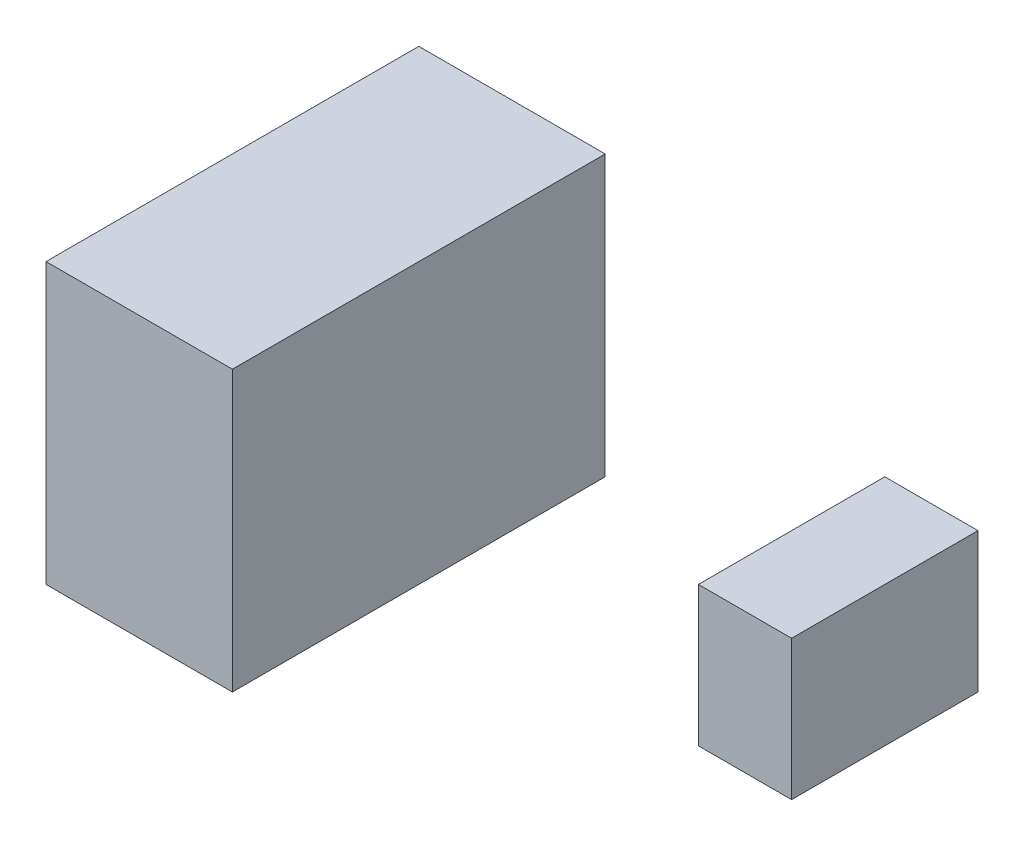
ISO-10303-21;
HEADER;
FILE_DESCRIPTION(('STEP AP214'),'2;1');
FILE_NAME('part.step','',(''),(''),'','','');
FILE_SCHEMA(('AUTOMOTIVE_DESIGN { 1 0 10303 214 1 1 1 1 }'));
ENDSEC;
DATA;
#1=APPLICATION_CONTEXT('core data for automotive mechanical design processes');
#2=APPLICATION_PROTOCOL_DEFINITION('international standard','automotive_design',2000,#1);
#3=PRODUCT_CONTEXT('',#1,'mechanical');
#4=PRODUCT('Part','Part','',(#3));
#5=PRODUCT_RELATED_PRODUCT_CATEGORY('part','',(#4));
#6=PRODUCT_DEFINITION_FORMATION('','',#4);
#7=PRODUCT_DEFINITION_CONTEXT('part definition',#1,'design');
#8=PRODUCT_DEFINITION('design','',#6,#7);
#9=PRODUCT_DEFINITION_SHAPE('','',#8);
#10=(LENGTH_UNIT() NAMED_UNIT(*) SI_UNIT(.MILLI.,.METRE.));
#11=(NAMED_UNIT(*) PLANE_ANGLE_UNIT() SI_UNIT($,.RADIAN.));
#12=(NAMED_UNIT(*) SI_UNIT($,.STERADIAN.) SOLID_ANGLE_UNIT());
#13=UNCERTAINTY_MEASURE_WITH_UNIT(LENGTH_MEASURE(1.E-05),#10,'distance_accuracy_value','');
#14=(GEOMETRIC_REPRESENTATION_CONTEXT(3) GLOBAL_UNCERTAINTY_ASSIGNED_CONTEXT((#13)) GLOBAL_UNIT_ASSIGNED_CONTEXT((#10,
#11,#12)) REPRESENTATION_CONTEXT('',''));
#15=CARTESIAN_POINT('',(0.,0.,0.));
#16=DIRECTION('',(0.,0.,1.));
#17=DIRECTION('',(1.,0.,0.));
#18=AXIS2_PLACEMENT_3D('',#15,#16,#17);
#19=CARTESIAN_POINT('',(50.,15.,20.));
#20=DIRECTION('',(1.,0.,0.));
#21=DIRECTION('',(0.,0.,-1.));
#22=AXIS2_PLACEMENT_3D('',#19,#20,#21);
#23=PLANE('',#22);
#24=DIRECTION('',(0.,-1.,0.));
#25=VECTOR('',#24,1.);
#26=CARTESIAN_POINT('',(50.,15.,0.));
#27=LINE('',#26,#25);
#28=CARTESIAN_POINT('',(50.,15.,0.));
#29=VERTEX_POINT('',#28);
#30=CARTESIAN_POINT('',(50.,0.,0.));
#31=VERTEX_POINT('',#30);
#32=EDGE_CURVE('E116',#29,#31,#27,.T.);
#33=ORIENTED_EDGE('',*,*,#32,.T.);
#34=DIRECTION('',(0.,0.,-1.));
#35=VECTOR('',#34,1.);
#36=CARTESIAN_POINT('',(50.,0.,20.));
#37=LINE('',#36,#35);
#38=CARTESIAN_POINT('',(50.,0.,20.));
#39=VERTEX_POINT('',#38);
#40=EDGE_CURVE('E12',#39,#31,#37,.T.);
#41=ORIENTED_EDGE('',*,*,#40,.F.);
#42=DIRECTION('',(0.,-1.,0.));
#43=VECTOR('',#42,1.);
#44=CARTESIAN_POINT('',(50.,15.,20.));
#45=LINE('',#44,#43);
#46=CARTESIAN_POINT('',(50.,15.,20.));
#47=VERTEX_POINT('',#46);
#48=EDGE_CURVE('E104',#47,#39,#45,.T.);
#49=ORIENTED_EDGE('',*,*,#48,.F.);
#50=DIRECTION('',(0.,0.,-1.));
#51=VECTOR('',#50,1.);
#52=CARTESIAN_POINT('',(50.,15.,20.));
#53=LINE('',#52,#51);
#54=EDGE_CURVE('E112',#47,#29,#53,.T.);
#55=ORIENTED_EDGE('',*,*,#54,.T.);
#56=EDGE_LOOP('',(#33,#41,#49,#55));
#57=FACE_BOUND('',#56,.T.);
#58=ADVANCED_FACE('F53',(#57),#23,.F.);
#59=CARTESIAN_POINT('',(50.,0.,20.));
#60=DIRECTION('',(0.,1.,0.));
#61=DIRECTION('',(0.,0.,1.));
#62=AXIS2_PLACEMENT_3D('',#59,#60,#61);
#63=PLANE('',#62);
#64=DIRECTION('',(1.,0.,0.));
#65=VECTOR('',#64,1.);
#66=CARTESIAN_POINT('',(50.,0.,0.));
#67=LINE('',#66,#65);
#68=CARTESIAN_POINT('',(60.,0.,0.));
#69=VERTEX_POINT('',#68);
#70=EDGE_CURVE('E108',#31,#69,#67,.T.);
#71=ORIENTED_EDGE('',*,*,#70,.T.);
#72=DIRECTION('',(0.,0.,-1.));
#73=VECTOR('',#72,1.);
#74=CARTESIAN_POINT('',(60.,0.,20.));
#75=LINE('',#74,#73);
#76=CARTESIAN_POINT('',(60.,0.,20.));
#77=VERTEX_POINT('',#76);
#78=EDGE_CURVE('E61',#77,#69,#75,.T.);
#79=ORIENTED_EDGE('',*,*,#78,.F.);
#80=DIRECTION('',(1.,0.,0.));
#81=VECTOR('',#80,1.);
#82=CARTESIAN_POINT('',(50.,0.,20.));
#83=LINE('',#82,#81);
#84=EDGE_CURVE('E99',#39,#77,#83,.T.);
#85=ORIENTED_EDGE('',*,*,#84,.F.);
#86=ORIENTED_EDGE('',*,*,#40,.T.);
#87=EDGE_LOOP('',(#71,#79,#85,#86));
#88=FACE_BOUND('',#87,.T.);
#89=ADVANCED_FACE('F107',(#88),#63,.F.);
#90=CARTESIAN_POINT('',(60.,0.,20.));
#91=DIRECTION('',(-1.,0.,0.));
#92=DIRECTION('',(0.,0.,1.));
#93=AXIS2_PLACEMENT_3D('',#90,#91,#92);
#94=PLANE('',#93);
#95=DIRECTION('',(0.,1.,0.));
#96=VECTOR('',#95,1.);
#97=CARTESIAN_POINT('',(60.,0.,0.));
#98=LINE('',#97,#96);
#99=CARTESIAN_POINT('',(60.,15.,0.));
#100=VERTEX_POINT('',#99);
#101=EDGE_CURVE('E86',#69,#100,#98,.T.);
#102=ORIENTED_EDGE('',*,*,#101,.T.);
#103=DIRECTION('',(0.,0.,-1.));
#104=VECTOR('',#103,1.);
#105=CARTESIAN_POINT('',(60.,15.,20.));
#106=LINE('',#105,#104);
#107=CARTESIAN_POINT('',(60.,15.,20.));
#108=VERTEX_POINT('',#107);
#109=EDGE_CURVE('E109',#108,#100,#106,.T.);
#110=ORIENTED_EDGE('',*,*,#109,.F.);
#111=DIRECTION('',(0.,1.,0.));
#112=VECTOR('',#111,1.);
#113=CARTESIAN_POINT('',(60.,0.,20.));
#114=LINE('',#113,#112);
#115=EDGE_CURVE('E102',#77,#108,#114,.T.);
#116=ORIENTED_EDGE('',*,*,#115,.F.);
#117=ORIENTED_EDGE('',*,*,#78,.T.);
#118=EDGE_LOOP('',(#102,#110,#116,#117));
#119=FACE_BOUND('',#118,.T.);
#120=ADVANCED_FACE('F110',(#119),#94,.F.);
#121=CARTESIAN_POINT('',(60.,15.,20.));
#122=DIRECTION('',(0.,-1.,0.));
#123=DIRECTION('',(0.,0.,-1.));
#124=AXIS2_PLACEMENT_3D('',#121,#122,#123);
#125=PLANE('',#124);
#126=DIRECTION('',(-1.,0.,0.));
#127=VECTOR('',#126,1.);
#128=CARTESIAN_POINT('',(60.,15.,0.));
#129=LINE('',#128,#127);
#130=EDGE_CURVE('E92',#100,#29,#129,.T.);
#131=ORIENTED_EDGE('',*,*,#130,.T.);
#132=ORIENTED_EDGE('',*,*,#54,.F.);
#133=DIRECTION('',(-1.,0.,0.));
#134=VECTOR('',#133,1.);
#135=CARTESIAN_POINT('',(60.,15.,20.));
#136=LINE('',#135,#134);
#137=EDGE_CURVE('E69',#108,#47,#136,.T.);
#138=ORIENTED_EDGE('',*,*,#137,.F.);
#139=ORIENTED_EDGE('',*,*,#109,.T.);
#140=EDGE_LOOP('',(#131,#132,#138,#139));
#141=FACE_BOUND('',#140,.T.);
#142=ADVANCED_FACE('F123',(#141),#125,.F.);
#143=CARTESIAN_POINT('',(0.,0.,20.));
#144=DIRECTION('',(0.,0.,1.));
#145=DIRECTION('',(1.,0.,0.));
#146=AXIS2_PLACEMENT_3D('',#143,#144,#145);
#147=PLANE('',#146);
#148=ORIENTED_EDGE('',*,*,#48,.T.);
#149=ORIENTED_EDGE('',*,*,#84,.T.);
#150=ORIENTED_EDGE('',*,*,#115,.T.);
#151=ORIENTED_EDGE('',*,*,#137,.T.);
#152=EDGE_LOOP('',(#148,#149,#150,#151));
#153=FACE_BOUND('',#152,.T.);
#154=ADVANCED_FACE('F100',(#153),#147,.T.);
#155=CARTESIAN_POINT('',(0.,0.,0.));
#156=DIRECTION('',(0.,0.,1.));
#157=DIRECTION('',(1.,0.,0.));
#158=AXIS2_PLACEMENT_3D('',#155,#156,#157);
#159=PLANE('',#158);
#160=ORIENTED_EDGE('',*,*,#32,.F.);
#161=ORIENTED_EDGE('',*,*,#130,.F.);
#162=ORIENTED_EDGE('',*,*,#101,.F.);
#163=ORIENTED_EDGE('',*,*,#70,.F.);
#164=EDGE_LOOP('',(#160,#161,#162,#163));
#165=FACE_BOUND('',#164,.T.);
#166=ADVANCED_FACE('F126',(#165),#159,.F.);
#167=CLOSED_SHELL('',(#58,#89,#120,#142,#154,#166));
#168=MANIFOLD_SOLID_BREP('B2',#167);
#169=CARTESIAN_POINT('',(0.,30.,40.));
#170=DIRECTION('',(1.,0.,0.));
#171=DIRECTION('',(0.,0.,-1.));
#172=AXIS2_PLACEMENT_3D('',#169,#170,#171);
#173=PLANE('',#172);
#174=DIRECTION('',(0.,-1.,0.));
#175=VECTOR('',#174,1.);
#176=CARTESIAN_POINT('',(0.,30.,0.));
#177=LINE('',#176,#175);
#178=CARTESIAN_POINT('',(0.,30.,0.));
#179=VERTEX_POINT('',#178);
#180=CARTESIAN_POINT('',(0.,0.,0.));
#181=VERTEX_POINT('',#180);
#182=EDGE_CURVE('E240',#179,#181,#177,.T.);
#183=ORIENTED_EDGE('',*,*,#182,.T.);
#184=DIRECTION('',(0.,0.,-1.));
#185=VECTOR('',#184,1.);
#186=CARTESIAN_POINT('',(0.,0.,40.));
#187=LINE('',#186,#185);
#188=CARTESIAN_POINT('',(0.,0.,40.));
#189=VERTEX_POINT('',#188);
#190=EDGE_CURVE('E51',#189,#181,#187,.T.);
#191=ORIENTED_EDGE('',*,*,#190,.F.);
#192=DIRECTION('',(0.,-1.,0.));
#193=VECTOR('',#192,1.);
#194=CARTESIAN_POINT('',(0.,30.,40.));
#195=LINE('',#194,#193);
#196=CARTESIAN_POINT('',(0.,30.,40.));
#197=VERTEX_POINT('',#196);
#198=EDGE_CURVE('E228',#197,#189,#195,.T.);
#199=ORIENTED_EDGE('',*,*,#198,.F.);
#200=DIRECTION('',(0.,0.,-1.));
#201=VECTOR('',#200,1.);
#202=CARTESIAN_POINT('',(0.,30.,40.));
#203=LINE('',#202,#201);
#204=EDGE_CURVE('E236',#197,#179,#203,.T.);
#205=ORIENTED_EDGE('',*,*,#204,.T.);
#206=EDGE_LOOP('',(#183,#191,#199,#205));
#207=FACE_BOUND('',#206,.T.);
#208=ADVANCED_FACE('F177',(#207),#173,.F.);
#209=CARTESIAN_POINT('',(0.,0.,40.));
#210=DIRECTION('',(0.,1.,0.));
#211=DIRECTION('',(0.,0.,1.));
#212=AXIS2_PLACEMENT_3D('',#209,#210,#211);
#213=PLANE('',#212);
#214=DIRECTION('',(1.,0.,0.));
#215=VECTOR('',#214,1.);
#216=CARTESIAN_POINT('',(0.,0.,0.));
#217=LINE('',#216,#215);
#218=CARTESIAN_POINT('',(20.,0.,0.));
#219=VERTEX_POINT('',#218);
#220=EDGE_CURVE('E232',#181,#219,#217,.T.);
#221=ORIENTED_EDGE('',*,*,#220,.T.);
#222=DIRECTION('',(0.,0.,-1.));
#223=VECTOR('',#222,1.);
#224=CARTESIAN_POINT('',(20.,0.,40.));
#225=LINE('',#224,#223);
#226=CARTESIAN_POINT('',(20.,0.,40.));
#227=VERTEX_POINT('',#226);
#228=EDGE_CURVE('E185',#227,#219,#225,.T.);
#229=ORIENTED_EDGE('',*,*,#228,.F.);
#230=DIRECTION('',(1.,0.,0.));
#231=VECTOR('',#230,1.);
#232=CARTESIAN_POINT('',(0.,0.,40.));
#233=LINE('',#232,#231);
#234=EDGE_CURVE('E223',#189,#227,#233,.T.);
#235=ORIENTED_EDGE('',*,*,#234,.F.);
#236=ORIENTED_EDGE('',*,*,#190,.T.);
#237=EDGE_LOOP('',(#221,#229,#235,#236));
#238=FACE_BOUND('',#237,.T.);
#239=ADVANCED_FACE('F231',(#238),#213,.F.);
#240=CARTESIAN_POINT('',(20.,0.,40.));
#241=DIRECTION('',(-1.,0.,0.));
#242=DIRECTION('',(0.,0.,1.));
#243=AXIS2_PLACEMENT_3D('',#240,#241,#242);
#244=PLANE('',#243);
#245=DIRECTION('',(0.,1.,0.));
#246=VECTOR('',#245,1.);
#247=CARTESIAN_POINT('',(20.,0.,0.));
#248=LINE('',#247,#246);
#249=CARTESIAN_POINT('',(20.,30.,0.));
#250=VERTEX_POINT('',#249);
#251=EDGE_CURVE('E210',#219,#250,#248,.T.);
#252=ORIENTED_EDGE('',*,*,#251,.T.);
#253=DIRECTION('',(0.,0.,-1.));
#254=VECTOR('',#253,1.);
#255=CARTESIAN_POINT('',(20.,30.,40.));
#256=LINE('',#255,#254);
#257=CARTESIAN_POINT('',(20.,30.,40.));
#258=VERTEX_POINT('',#257);
#259=EDGE_CURVE('E233',#258,#250,#256,.T.);
#260=ORIENTED_EDGE('',*,*,#259,.F.);
#261=DIRECTION('',(0.,1.,0.));
#262=VECTOR('',#261,1.);
#263=CARTESIAN_POINT('',(20.,0.,40.));
#264=LINE('',#263,#262);
#265=EDGE_CURVE('E226',#227,#258,#264,.T.);
#266=ORIENTED_EDGE('',*,*,#265,.F.);
#267=ORIENTED_EDGE('',*,*,#228,.T.);
#268=EDGE_LOOP('',(#252,#260,#266,#267));
#269=FACE_BOUND('',#268,.T.);
#270=ADVANCED_FACE('F234',(#269),#244,.F.);
#271=CARTESIAN_POINT('',(20.,30.,40.));
#272=DIRECTION('',(0.,-1.,0.));
#273=DIRECTION('',(0.,0.,-1.));
#274=AXIS2_PLACEMENT_3D('',#271,#272,#273);
#275=PLANE('',#274);
#276=DIRECTION('',(-1.,0.,0.));
#277=VECTOR('',#276,1.);
#278=CARTESIAN_POINT('',(20.,30.,0.));
#279=LINE('',#278,#277);
#280=EDGE_CURVE('E216',#250,#179,#279,.T.);
#281=ORIENTED_EDGE('',*,*,#280,.T.);
#282=ORIENTED_EDGE('',*,*,#204,.F.);
#283=DIRECTION('',(-1.,0.,0.));
#284=VECTOR('',#283,1.);
#285=CARTESIAN_POINT('',(20.,30.,40.));
#286=LINE('',#285,#284);
#287=EDGE_CURVE('E193',#258,#197,#286,.T.);
#288=ORIENTED_EDGE('',*,*,#287,.F.);
#289=ORIENTED_EDGE('',*,*,#259,.T.);
#290=EDGE_LOOP('',(#281,#282,#288,#289));
#291=FACE_BOUND('',#290,.T.);
#292=ADVANCED_FACE('F247',(#291),#275,.F.);
#293=CARTESIAN_POINT('',(0.,0.,40.));
#294=DIRECTION('',(0.,0.,1.));
#295=DIRECTION('',(1.,0.,0.));
#296=AXIS2_PLACEMENT_3D('',#293,#294,#295);
#297=PLANE('',#296);
#298=ORIENTED_EDGE('',*,*,#198,.T.);
#299=ORIENTED_EDGE('',*,*,#234,.T.);
#300=ORIENTED_EDGE('',*,*,#265,.T.);
#301=ORIENTED_EDGE('',*,*,#287,.T.);
#302=EDGE_LOOP('',(#298,#299,#300,#301));
#303=FACE_BOUND('',#302,.T.);
#304=ADVANCED_FACE('F224',(#303),#297,.T.);
#305=CARTESIAN_POINT('',(0.,0.,0.));
#306=DIRECTION('',(0.,0.,1.));
#307=DIRECTION('',(1.,0.,0.));
#308=AXIS2_PLACEMENT_3D('',#305,#306,#307);
#309=PLANE('',#308);
#310=ORIENTED_EDGE('',*,*,#182,.F.);
#311=ORIENTED_EDGE('',*,*,#280,.F.);
#312=ORIENTED_EDGE('',*,*,#251,.F.);
#313=ORIENTED_EDGE('',*,*,#220,.F.);
#314=EDGE_LOOP('',(#310,#311,#312,#313));
#315=FACE_BOUND('',#314,.T.);
#316=ADVANCED_FACE('F250',(#315),#309,.F.);
#317=CLOSED_SHELL('',(#208,#239,#270,#292,#304,#316));
#318=MANIFOLD_SOLID_BREP('B6',#317);
#319=ADVANCED_BREP_SHAPE_REPRESENTATION('',(#18,#168,#318),#14);
#320=SHAPE_DEFINITION_REPRESENTATION(#9,#319);
ENDSEC;
END-ISO-10303-21;
